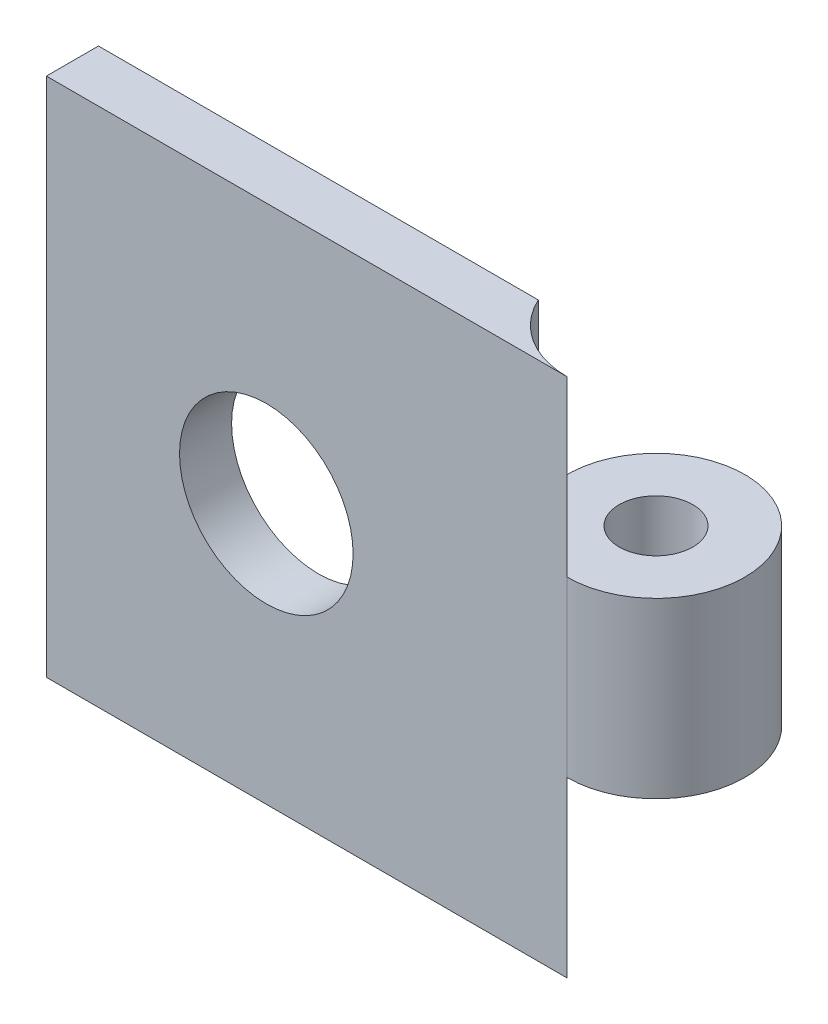
ISO-10303-21;
HEADER;
FILE_DESCRIPTION(('STEP AP214'),'2;1');
FILE_NAME('part.step','',(''),(''),'','','');
FILE_SCHEMA(('AUTOMOTIVE_DESIGN { 1 0 10303 214 1 1 1 1 }'));
ENDSEC;
DATA;
#1=APPLICATION_CONTEXT('core data for automotive mechanical design processes');
#2=APPLICATION_PROTOCOL_DEFINITION('international standard','automotive_design',2000,#1);
#3=PRODUCT_CONTEXT('',#1,'mechanical');
#4=PRODUCT('Part','Part','',(#3));
#5=PRODUCT_RELATED_PRODUCT_CATEGORY('part','',(#4));
#6=PRODUCT_DEFINITION_FORMATION('','',#4);
#7=PRODUCT_DEFINITION_CONTEXT('part definition',#1,'design');
#8=PRODUCT_DEFINITION('design','',#6,#7);
#9=PRODUCT_DEFINITION_SHAPE('','',#8);
#10=(LENGTH_UNIT() NAMED_UNIT(*) SI_UNIT(.MILLI.,.METRE.));
#11=(NAMED_UNIT(*) PLANE_ANGLE_UNIT() SI_UNIT($,.RADIAN.));
#12=(NAMED_UNIT(*) SI_UNIT($,.STERADIAN.) SOLID_ANGLE_UNIT());
#13=UNCERTAINTY_MEASURE_WITH_UNIT(LENGTH_MEASURE(1.E-05),#10,'distance_accuracy_value','');
#14=(GEOMETRIC_REPRESENTATION_CONTEXT(3) GLOBAL_UNCERTAINTY_ASSIGNED_CONTEXT((#13)) GLOBAL_UNIT_ASSIGNED_CONTEXT((#10,
#11,#12)) REPRESENTATION_CONTEXT('',''));
#15=CARTESIAN_POINT('',(0.,0.,0.));
#16=DIRECTION('',(0.,0.,1.));
#17=DIRECTION('',(1.,0.,0.));
#18=AXIS2_PLACEMENT_3D('',#15,#16,#17);
#19=CARTESIAN_POINT('',(15.,-7.5,-2.56));
#20=DIRECTION('',(0.,1.,0.));
#21=DIRECTION('',(0.,0.,1.));
#22=AXIS2_PLACEMENT_3D('',#19,#20,#21);
#23=CYLINDRICAL_SURFACE('',#22,2.56);
#24=CARTESIAN_POINT('',(15.,-2.5,-2.56));
#25=DIRECTION('',(0.,1.,0.));
#26=DIRECTION('',(0.,0.,1.));
#27=AXIS2_PLACEMENT_3D('',#24,#25,#26);
#28=CIRCLE('',#27,2.56);
#29=CARTESIAN_POINT('',(12.6697639604538,-2.5,-1.5));
#30=VERTEX_POINT('',#29);
#31=CARTESIAN_POINT('',(15.,-2.5,0.));
#32=VERTEX_POINT('',#31);
#33=EDGE_CURVE('E57',#30,#32,#28,.T.);
#34=ORIENTED_EDGE('',*,*,#33,.T.);
#35=DIRECTION('',(0.,1.,0.));
#36=VECTOR('',#35,1.);
#37=CARTESIAN_POINT('',(15.,-7.5,0.));
#38=LINE('',#37,#36);
#39=CARTESIAN_POINT('',(15.,-7.5,0.));
#40=VERTEX_POINT('',#39);
#41=EDGE_CURVE('E11',#40,#32,#38,.T.);
#42=ORIENTED_EDGE('',*,*,#41,.F.);
#43=CARTESIAN_POINT('',(15.,-7.5,-2.56));
#44=DIRECTION('',(0.,1.,0.));
#45=DIRECTION('',(0.,0.,1.));
#46=AXIS2_PLACEMENT_3D('',#43,#44,#45);
#47=CIRCLE('',#46,2.56);
#48=CARTESIAN_POINT('',(12.6697639604538,-7.5,-1.5));
#49=VERTEX_POINT('',#48);
#50=EDGE_CURVE('E130',#49,#40,#47,.T.);
#51=ORIENTED_EDGE('',*,*,#50,.F.);
#52=DIRECTION('',(0.,1.,0.));
#53=VECTOR('',#52,1.);
#54=CARTESIAN_POINT('',(12.6697639604538,-7.5,-1.5));
#55=LINE('',#54,#53);
#56=EDGE_CURVE('E37',#49,#30,#55,.T.);
#57=ORIENTED_EDGE('',*,*,#56,.T.);
#58=EDGE_LOOP('',(#34,#42,#51,#57));
#59=FACE_BOUND('',#58,.T.);
#60=ADVANCED_FACE('F33',(#59),#23,.F.);
#61=CARTESIAN_POINT('',(15.,2.5,0.));
#62=VERTEX_POINT('',#61);
#63=CARTESIAN_POINT('',(15.,7.5,0.));
#64=VERTEX_POINT('',#63);
#65=EDGE_CURVE('E42',#62,#64,#38,.T.);
#66=ORIENTED_EDGE('',*,*,#65,.F.);
#67=CARTESIAN_POINT('',(15.,2.5,-2.56));
#68=DIRECTION('',(0.,1.,0.));
#69=DIRECTION('',(0.,0.,1.));
#70=AXIS2_PLACEMENT_3D('',#67,#68,#69);
#71=CIRCLE('',#70,2.56);
#72=CARTESIAN_POINT('',(12.6697639604538,2.5,-1.5));
#73=VERTEX_POINT('',#72);
#74=EDGE_CURVE('E98',#73,#62,#71,.T.);
#75=ORIENTED_EDGE('',*,*,#74,.F.);
#76=CARTESIAN_POINT('',(12.6697639604538,7.5,-1.5));
#77=VERTEX_POINT('',#76);
#78=EDGE_CURVE('E88',#73,#77,#55,.T.);
#79=ORIENTED_EDGE('',*,*,#78,.T.);
#80=CARTESIAN_POINT('',(15.,7.5,-2.56));
#81=DIRECTION('',(0.,1.,0.));
#82=DIRECTION('',(0.,0.,1.));
#83=AXIS2_PLACEMENT_3D('',#80,#81,#82);
#84=CIRCLE('',#83,2.56);
#85=EDGE_CURVE('E121',#77,#64,#84,.T.);
#86=ORIENTED_EDGE('',*,*,#85,.T.);
#87=EDGE_LOOP('',(#66,#75,#79,#86));
#88=FACE_BOUND('',#87,.T.);
#89=ADVANCED_FACE('F35',(#88),#23,.F.);
#90=CARTESIAN_POINT('',(0.,-7.5,0.));
#91=DIRECTION('',(0.,0.,1.));
#92=DIRECTION('',(1.,0.,0.));
#93=AXIS2_PLACEMENT_3D('',#90,#91,#92);
#94=PLANE('',#93);
#95=CARTESIAN_POINT('',(6.33488198022689,0.,0.));
#96=DIRECTION('',(0.,0.,1.));
#97=DIRECTION('',(1.,0.,0.));
#98=AXIS2_PLACEMENT_3D('',#95,#96,#97);
#99=CIRCLE('',#98,2.5);
#100=CARTESIAN_POINT('',(8.83488198022689,0.,0.));
#101=VERTEX_POINT('',#100);
#102=EDGE_CURVE('E191',#101,#101,#99,.T.);
#103=ORIENTED_EDGE('',*,*,#102,.F.);
#104=EDGE_LOOP('',(#103));
#105=FACE_BOUND('',#104,.T.);
#106=ORIENTED_EDGE('',*,*,#41,.T.);
#107=DIRECTION('',(0.,1.,0.));
#108=VECTOR('',#107,1.);
#109=CARTESIAN_POINT('',(15.,-2.5,0.));
#110=LINE('',#109,#108);
#111=EDGE_CURVE('E119',#32,#62,#110,.T.);
#112=ORIENTED_EDGE('',*,*,#111,.T.);
#113=ORIENTED_EDGE('',*,*,#65,.T.);
#114=DIRECTION('',(1.,0.,0.));
#115=VECTOR('',#114,1.);
#116=CARTESIAN_POINT('',(0.,7.5,0.));
#117=LINE('',#116,#115);
#118=CARTESIAN_POINT('',(0.,7.5,0.));
#119=VERTEX_POINT('',#118);
#120=EDGE_CURVE('E127',#119,#64,#117,.T.);
#121=ORIENTED_EDGE('',*,*,#120,.F.);
#122=DIRECTION('',(0.,1.,0.));
#123=VECTOR('',#122,1.);
#124=CARTESIAN_POINT('',(0.,-7.5,0.));
#125=LINE('',#124,#123);
#126=CARTESIAN_POINT('',(0.,-7.5,0.));
#127=VERTEX_POINT('',#126);
#128=EDGE_CURVE('E138',#127,#119,#125,.T.);
#129=ORIENTED_EDGE('',*,*,#128,.F.);
#130=DIRECTION('',(1.,0.,0.));
#131=VECTOR('',#130,1.);
#132=CARTESIAN_POINT('',(0.,-7.5,0.));
#133=LINE('',#132,#131);
#134=EDGE_CURVE('E96',#127,#40,#133,.T.);
#135=ORIENTED_EDGE('',*,*,#134,.T.);
#136=EDGE_LOOP('',(#106,#112,#113,#121,#129,#135));
#137=FACE_BOUND('',#136,.T.);
#138=ADVANCED_FACE('F163',(#105,#137),#94,.T.);
#139=CARTESIAN_POINT('',(0.,-7.5,0.));
#140=DIRECTION('',(1.,0.,0.));
#141=DIRECTION('',(0.,0.,-1.));
#142=AXIS2_PLACEMENT_3D('',#139,#140,#141);
#143=PLANE('',#142);
#144=ORIENTED_EDGE('',*,*,#128,.T.);
#145=DIRECTION('',(0.,0.,-1.));
#146=VECTOR('',#145,1.);
#147=CARTESIAN_POINT('',(0.,7.5,0.));
#148=LINE('',#147,#146);
#149=CARTESIAN_POINT('',(0.,7.5,-1.5));
#150=VERTEX_POINT('',#149);
#151=EDGE_CURVE('E124',#119,#150,#148,.T.);
#152=ORIENTED_EDGE('',*,*,#151,.T.);
#153=DIRECTION('',(0.,1.,0.));
#154=VECTOR('',#153,1.);
#155=CARTESIAN_POINT('',(0.,-7.5,-1.5));
#156=LINE('',#155,#154);
#157=CARTESIAN_POINT('',(0.,-7.5,-1.5));
#158=VERTEX_POINT('',#157);
#159=EDGE_CURVE('E139',#158,#150,#156,.T.);
#160=ORIENTED_EDGE('',*,*,#159,.F.);
#161=DIRECTION('',(0.,0.,-1.));
#162=VECTOR('',#161,1.);
#163=CARTESIAN_POINT('',(0.,-7.5,0.));
#164=LINE('',#163,#162);
#165=EDGE_CURVE('E134',#127,#158,#164,.T.);
#166=ORIENTED_EDGE('',*,*,#165,.F.);
#167=EDGE_LOOP('',(#144,#152,#160,#166));
#168=FACE_BOUND('',#167,.T.);
#169=ADVANCED_FACE('F167',(#168),#143,.F.);
#170=CARTESIAN_POINT('',(0.,-7.5,-1.5));
#171=DIRECTION('',(0.,0.,1.));
#172=DIRECTION('',(1.,0.,0.));
#173=AXIS2_PLACEMENT_3D('',#170,#171,#172);
#174=PLANE('',#173);
#175=CARTESIAN_POINT('',(6.33488198022689,0.,-1.5));
#176=DIRECTION('',(0.,0.,-1.));
#177=DIRECTION('',(-1.,0.,0.));
#178=AXIS2_PLACEMENT_3D('',#175,#176,#177);
#179=CIRCLE('',#178,2.5);
#180=CARTESIAN_POINT('',(3.83488198022689,0.,-1.5));
#181=VERTEX_POINT('',#180);
#182=EDGE_CURVE('E189',#181,#181,#179,.T.);
#183=ORIENTED_EDGE('',*,*,#182,.F.);
#184=EDGE_LOOP('',(#183));
#185=FACE_BOUND('',#184,.T.);
#186=ORIENTED_EDGE('',*,*,#159,.T.);
#187=DIRECTION('',(1.,0.,0.));
#188=VECTOR('',#187,1.);
#189=CARTESIAN_POINT('',(0.,7.5,-1.5));
#190=LINE('',#189,#188);
#191=EDGE_CURVE('E94',#150,#77,#190,.T.);
#192=ORIENTED_EDGE('',*,*,#191,.T.);
#193=ORIENTED_EDGE('',*,*,#78,.F.);
#194=EDGE_CURVE('E92',#30,#73,#55,.T.);
#195=ORIENTED_EDGE('',*,*,#194,.F.);
#196=ORIENTED_EDGE('',*,*,#56,.F.);
#197=DIRECTION('',(1.,0.,0.));
#198=VECTOR('',#197,1.);
#199=CARTESIAN_POINT('',(0.,-7.5,-1.5));
#200=LINE('',#199,#198);
#201=EDGE_CURVE('E132',#158,#49,#200,.T.);
#202=ORIENTED_EDGE('',*,*,#201,.F.);
#203=EDGE_LOOP('',(#186,#192,#193,#195,#196,#202));
#204=FACE_BOUND('',#203,.T.);
#205=ADVANCED_FACE('F89',(#185,#204),#174,.F.);
#206=CARTESIAN_POINT('',(0.,-7.5,0.));
#207=DIRECTION('',(0.,1.,0.));
#208=DIRECTION('',(0.,0.,1.));
#209=AXIS2_PLACEMENT_3D('',#206,#207,#208);
#210=PLANE('',#209);
#211=ORIENTED_EDGE('',*,*,#50,.T.);
#212=ORIENTED_EDGE('',*,*,#134,.F.);
#213=ORIENTED_EDGE('',*,*,#165,.T.);
#214=ORIENTED_EDGE('',*,*,#201,.T.);
#215=EDGE_LOOP('',(#211,#212,#213,#214));
#216=FACE_BOUND('',#215,.T.);
#217=ADVANCED_FACE('F178',(#216),#210,.F.);
#218=CARTESIAN_POINT('',(0.,7.5,0.));
#219=DIRECTION('',(0.,1.,0.));
#220=DIRECTION('',(0.,0.,1.));
#221=AXIS2_PLACEMENT_3D('',#218,#219,#220);
#222=PLANE('',#221);
#223=ORIENTED_EDGE('',*,*,#85,.F.);
#224=ORIENTED_EDGE('',*,*,#191,.F.);
#225=ORIENTED_EDGE('',*,*,#151,.F.);
#226=ORIENTED_EDGE('',*,*,#120,.T.);
#227=EDGE_LOOP('',(#223,#224,#225,#226));
#228=FACE_BOUND('',#227,.T.);
#229=ADVANCED_FACE('F185',(#228),#222,.T.);
#230=CARTESIAN_POINT('',(15.,-2.5,-2.56));
#231=DIRECTION('',(0.,1.,0.));
#232=DIRECTION('',(0.,0.,1.));
#233=AXIS2_PLACEMENT_3D('',#230,#231,#232);
#234=CYLINDRICAL_SURFACE('',#233,2.56);
#235=ORIENTED_EDGE('',*,*,#111,.F.);
#236=EDGE_CURVE('E110',#32,#30,#28,.T.);
#237=ORIENTED_EDGE('',*,*,#236,.T.);
#238=ORIENTED_EDGE('',*,*,#194,.T.);
#239=EDGE_CURVE('E102',#62,#73,#71,.T.);
#240=ORIENTED_EDGE('',*,*,#239,.F.);
#241=EDGE_LOOP('',(#235,#237,#238,#240));
#242=FACE_BOUND('',#241,.T.);
#243=ADVANCED_FACE('F108',(#242),#234,.T.);
#244=CARTESIAN_POINT('',(15.,-2.5,-2.56));
#245=DIRECTION('',(0.,1.,0.));
#246=DIRECTION('',(0.,0.,1.));
#247=AXIS2_PLACEMENT_3D('',#244,#245,#246);
#248=CYLINDRICAL_SURFACE('',#247,1.06);
#249=CARTESIAN_POINT('',(15.,-2.5,-2.56));
#250=DIRECTION('',(0.,1.,0.));
#251=DIRECTION('',(0.,0.,1.));
#252=AXIS2_PLACEMENT_3D('',#249,#250,#251);
#253=CIRCLE('',#252,1.06);
#254=CARTESIAN_POINT('',(15.,-2.5,-1.5));
#255=VERTEX_POINT('',#254);
#256=EDGE_CURVE('E112',#255,#255,#253,.T.);
#257=ORIENTED_EDGE('',*,*,#256,.F.);
#258=EDGE_LOOP('',(#257));
#259=FACE_BOUND('',#258,.T.);
#260=CARTESIAN_POINT('',(15.,2.5,-2.56));
#261=DIRECTION('',(0.,1.,0.));
#262=DIRECTION('',(0.,0.,1.));
#263=AXIS2_PLACEMENT_3D('',#260,#261,#262);
#264=CIRCLE('',#263,1.06);
#265=CARTESIAN_POINT('',(15.,2.5,-1.5));
#266=VERTEX_POINT('',#265);
#267=EDGE_CURVE('E103',#266,#266,#264,.T.);
#268=ORIENTED_EDGE('',*,*,#267,.T.);
#269=EDGE_LOOP('',(#268));
#270=FACE_BOUND('',#269,.T.);
#271=ADVANCED_FACE('F146',(#259,#270),#248,.F.);
#272=CARTESIAN_POINT('',(0.,-2.5,0.));
#273=DIRECTION('',(0.,1.,0.));
#274=DIRECTION('',(0.,0.,1.));
#275=AXIS2_PLACEMENT_3D('',#272,#273,#274);
#276=PLANE('',#275);
#277=ORIENTED_EDGE('',*,*,#256,.T.);
#278=EDGE_LOOP('',(#277));
#279=FACE_BOUND('',#278,.T.);
#280=ORIENTED_EDGE('',*,*,#236,.F.);
#281=ORIENTED_EDGE('',*,*,#33,.F.);
#282=EDGE_LOOP('',(#280,#281));
#283=FACE_BOUND('',#282,.T.);
#284=ADVANCED_FACE('F144',(#279,#283),#276,.F.);
#285=CARTESIAN_POINT('',(0.,2.5,0.));
#286=DIRECTION('',(0.,1.,0.));
#287=DIRECTION('',(0.,0.,1.));
#288=AXIS2_PLACEMENT_3D('',#285,#286,#287);
#289=PLANE('',#288);
#290=ORIENTED_EDGE('',*,*,#267,.F.);
#291=EDGE_LOOP('',(#290));
#292=FACE_BOUND('',#291,.T.);
#293=ORIENTED_EDGE('',*,*,#239,.T.);
#294=ORIENTED_EDGE('',*,*,#74,.T.);
#295=EDGE_LOOP('',(#293,#294));
#296=FACE_BOUND('',#295,.T.);
#297=ADVANCED_FACE('F111',(#292,#296),#289,.T.);
#298=CARTESIAN_POINT('',(6.33488198022689,0.,1.5));
#299=DIRECTION('',(0.,0.,-1.));
#300=DIRECTION('',(-1.,0.,0.));
#301=AXIS2_PLACEMENT_3D('',#298,#299,#300);
#302=CYLINDRICAL_SURFACE('',#301,2.5);
#303=ORIENTED_EDGE('',*,*,#102,.T.);
#304=EDGE_LOOP('',(#303));
#305=FACE_BOUND('',#304,.T.);
#306=ORIENTED_EDGE('',*,*,#182,.T.);
#307=EDGE_LOOP('',(#306));
#308=FACE_BOUND('',#307,.T.);
#309=ADVANCED_FACE('F153',(#305,#308),#302,.F.);
#310=CLOSED_SHELL('',(#60,#89,#138,#169,#205,#217,#229,#243,#271,#284,#297,#309));
#311=MANIFOLD_SOLID_BREP('B2',#310);
#312=ADVANCED_BREP_SHAPE_REPRESENTATION('',(#18,#311),#14);
#313=SHAPE_DEFINITION_REPRESENTATION(#9,#312);
ENDSEC;
END-ISO-10303-21;
